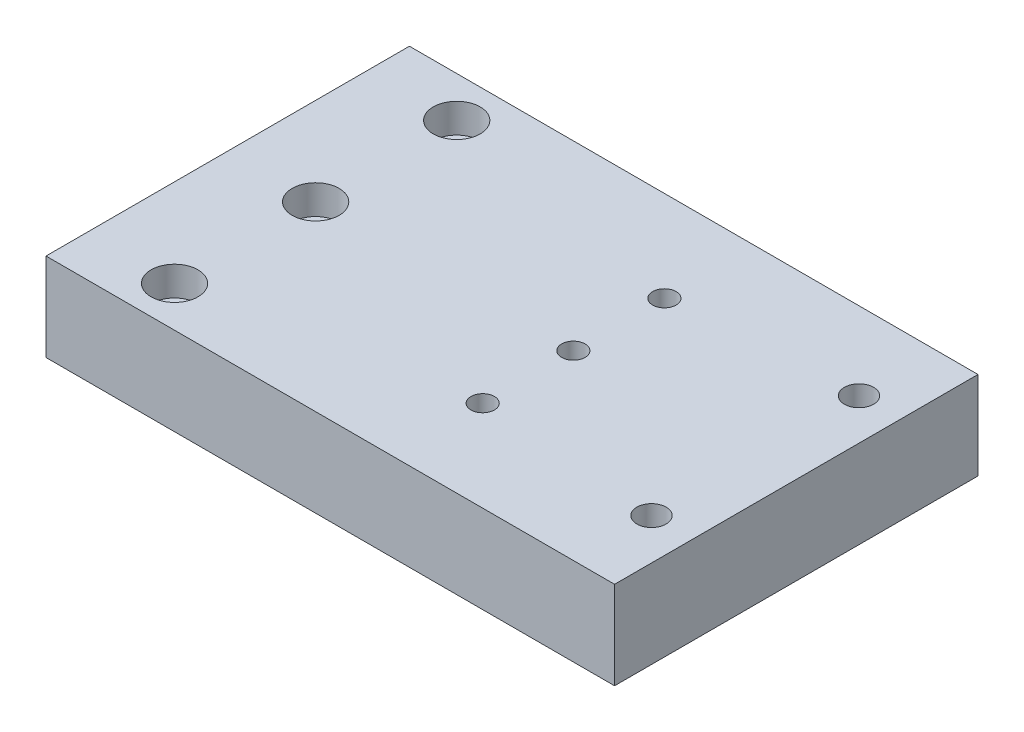
ISO-10303-21;
HEADER;
FILE_DESCRIPTION(('STEP AP214'),'2;1');
FILE_NAME('part.step','',(''),(''),'','','');
FILE_SCHEMA(('AUTOMOTIVE_DESIGN { 1 0 10303 214 1 1 1 1 }'));
ENDSEC;
DATA;
#1=APPLICATION_CONTEXT('core data for automotive mechanical design processes');
#2=APPLICATION_PROTOCOL_DEFINITION('international standard','automotive_design',2000,#1);
#3=PRODUCT_CONTEXT('',#1,'mechanical');
#4=PRODUCT('Part','Part','',(#3));
#5=PRODUCT_RELATED_PRODUCT_CATEGORY('part','',(#4));
#6=PRODUCT_DEFINITION_FORMATION('','',#4);
#7=PRODUCT_DEFINITION_CONTEXT('part definition',#1,'design');
#8=PRODUCT_DEFINITION('design','',#6,#7);
#9=PRODUCT_DEFINITION_SHAPE('','',#8);
#10=(LENGTH_UNIT() NAMED_UNIT(*) SI_UNIT(.MILLI.,.METRE.));
#11=(NAMED_UNIT(*) PLANE_ANGLE_UNIT() SI_UNIT($,.RADIAN.));
#12=(NAMED_UNIT(*) SI_UNIT($,.STERADIAN.) SOLID_ANGLE_UNIT());
#13=UNCERTAINTY_MEASURE_WITH_UNIT(LENGTH_MEASURE(1.E-05),#10,'distance_accuracy_value','');
#14=(GEOMETRIC_REPRESENTATION_CONTEXT(3) GLOBAL_UNCERTAINTY_ASSIGNED_CONTEXT((#13)) GLOBAL_UNIT_ASSIGNED_CONTEXT((#10,
#11,#12)) REPRESENTATION_CONTEXT('',''));
#15=CARTESIAN_POINT('',(0.,0.,0.));
#16=DIRECTION('',(0.,0.,1.));
#17=DIRECTION('',(1.,0.,0.));
#18=AXIS2_PLACEMENT_3D('',#15,#16,#17);
#19=CARTESIAN_POINT('',(-15.,0.,31.));
#20=DIRECTION('',(0.,1.,0.));
#21=DIRECTION('',(0.,0.,1.));
#22=AXIS2_PLACEMENT_3D('',#19,#20,#21);
#23=CYLINDRICAL_SURFACE('',#22,2.5);
#24=CARTESIAN_POINT('',(-15.,0.,31.));
#25=DIRECTION('',(0.,1.,0.));
#26=DIRECTION('',(0.,0.,1.));
#27=AXIS2_PLACEMENT_3D('',#24,#25,#26);
#28=CIRCLE('',#27,2.5);
#29=CARTESIAN_POINT('',(-15.,0.,33.5));
#30=VERTEX_POINT('',#29);
#31=EDGE_CURVE('E102',#30,#30,#28,.T.);
#32=ORIENTED_EDGE('',*,*,#31,.F.);
#33=EDGE_LOOP('',(#32));
#34=FACE_BOUND('',#33,.T.);
#35=CARTESIAN_POINT('',(-15.,10.,31.));
#36=DIRECTION('',(0.,1.,0.));
#37=DIRECTION('',(0.,0.,1.));
#38=AXIS2_PLACEMENT_3D('',#35,#36,#37);
#39=CIRCLE('',#38,2.5);
#40=CARTESIAN_POINT('',(-15.,10.,33.5));
#41=VERTEX_POINT('',#40);
#42=EDGE_CURVE('E39',#41,#41,#39,.F.);
#43=ORIENTED_EDGE('',*,*,#42,.F.);
#44=EDGE_LOOP('',(#43));
#45=FACE_BOUND('',#44,.T.);
#46=ADVANCED_FACE('F35',(#34,#45),#23,.F.);
#47=CARTESIAN_POINT('',(-15.,0.,6.93));
#48=DIRECTION('',(0.,1.,0.));
#49=DIRECTION('',(0.,0.,1.));
#50=AXIS2_PLACEMENT_3D('',#47,#48,#49);
#51=CYLINDRICAL_SURFACE('',#50,2.5);
#52=CARTESIAN_POINT('',(-15.,0.,6.93));
#53=DIRECTION('',(0.,1.,0.));
#54=DIRECTION('',(0.,0.,1.));
#55=AXIS2_PLACEMENT_3D('',#52,#53,#54);
#56=CIRCLE('',#55,2.5);
#57=CARTESIAN_POINT('',(-15.,0.,9.43));
#58=VERTEX_POINT('',#57);
#59=EDGE_CURVE('E105',#58,#58,#56,.T.);
#60=ORIENTED_EDGE('',*,*,#59,.F.);
#61=EDGE_LOOP('',(#60));
#62=FACE_BOUND('',#61,.T.);
#63=CARTESIAN_POINT('',(-15.,10.,6.93));
#64=DIRECTION('',(0.,1.,0.));
#65=DIRECTION('',(0.,0.,1.));
#66=AXIS2_PLACEMENT_3D('',#63,#64,#65);
#67=CIRCLE('',#66,2.5);
#68=CARTESIAN_POINT('',(-15.,10.,9.43));
#69=VERTEX_POINT('',#68);
#70=EDGE_CURVE('E149',#69,#69,#67,.F.);
#71=ORIENTED_EDGE('',*,*,#70,.F.);
#72=EDGE_LOOP('',(#71));
#73=FACE_BOUND('',#72,.T.);
#74=ADVANCED_FACE('F225',(#62,#73),#51,.F.);
#75=CARTESIAN_POINT('',(-15.,0.,55.07));
#76=DIRECTION('',(0.,1.,0.));
#77=DIRECTION('',(0.,0.,1.));
#78=AXIS2_PLACEMENT_3D('',#75,#76,#77);
#79=CYLINDRICAL_SURFACE('',#78,2.5);
#80=CARTESIAN_POINT('',(-15.,0.,55.07));
#81=DIRECTION('',(0.,1.,0.));
#82=DIRECTION('',(0.,0.,1.));
#83=AXIS2_PLACEMENT_3D('',#80,#81,#82);
#84=CIRCLE('',#83,2.5);
#85=CARTESIAN_POINT('',(-15.,0.,57.57));
#86=VERTEX_POINT('',#85);
#87=EDGE_CURVE('E155',#86,#86,#84,.T.);
#88=ORIENTED_EDGE('',*,*,#87,.F.);
#89=EDGE_LOOP('',(#88));
#90=FACE_BOUND('',#89,.T.);
#91=CARTESIAN_POINT('',(-15.,10.,55.07));
#92=DIRECTION('',(0.,1.,0.));
#93=DIRECTION('',(0.,0.,1.));
#94=AXIS2_PLACEMENT_3D('',#91,#92,#93);
#95=CIRCLE('',#94,2.5);
#96=CARTESIAN_POINT('',(-15.,10.,57.57));
#97=VERTEX_POINT('',#96);
#98=EDGE_CURVE('E147',#97,#97,#95,.F.);
#99=ORIENTED_EDGE('',*,*,#98,.F.);
#100=EDGE_LOOP('',(#99));
#101=FACE_BOUND('',#100,.T.);
#102=ADVANCED_FACE('F232',(#90,#101),#79,.F.);
#103=CARTESIAN_POINT('',(0.,15.,62.));
#104=DIRECTION('',(0.,0.,-1.));
#105=DIRECTION('',(-1.,0.,0.));
#106=AXIS2_PLACEMENT_3D('',#103,#104,#105);
#107=PLANE('',#106);
#108=DIRECTION('',(1.,0.,0.));
#109=VECTOR('',#108,1.);
#110=CARTESIAN_POINT('',(0.,0.,62.));
#111=LINE('',#110,#109);
#112=CARTESIAN_POINT('',(-30.,0.,62.));
#113=VERTEX_POINT('',#112);
#114=CARTESIAN_POINT('',(67.,0.,62.));
#115=VERTEX_POINT('',#114);
#116=EDGE_CURVE('E65',#113,#115,#111,.T.);
#117=ORIENTED_EDGE('',*,*,#116,.T.);
#118=DIRECTION('',(0.,-1.,0.));
#119=VECTOR('',#118,1.);
#120=CARTESIAN_POINT('',(67.,15.,62.));
#121=LINE('',#120,#119);
#122=CARTESIAN_POINT('',(67.,15.,62.));
#123=VERTEX_POINT('',#122);
#124=EDGE_CURVE('E11',#123,#115,#121,.T.);
#125=ORIENTED_EDGE('',*,*,#124,.F.);
#126=DIRECTION('',(1.,0.,0.));
#127=VECTOR('',#126,1.);
#128=CARTESIAN_POINT('',(0.,15.,62.));
#129=LINE('',#128,#127);
#130=CARTESIAN_POINT('',(-30.,15.,62.));
#131=VERTEX_POINT('',#130);
#132=EDGE_CURVE('E90',#131,#123,#129,.T.);
#133=ORIENTED_EDGE('',*,*,#132,.F.);
#134=DIRECTION('',(0.,1.,0.));
#135=VECTOR('',#134,1.);
#136=CARTESIAN_POINT('',(-30.,0.,62.));
#137=LINE('',#136,#135);
#138=EDGE_CURVE('E98',#113,#131,#137,.T.);
#139=ORIENTED_EDGE('',*,*,#138,.F.);
#140=EDGE_LOOP('',(#117,#125,#133,#139));
#141=FACE_BOUND('',#140,.T.);
#142=ADVANCED_FACE('F37',(#141),#107,.F.);
#143=CARTESIAN_POINT('',(67.,15.,0.));
#144=DIRECTION('',(-1.,0.,0.));
#145=DIRECTION('',(0.,0.,1.));
#146=AXIS2_PLACEMENT_3D('',#143,#144,#145);
#147=PLANE('',#146);
#148=DIRECTION('',(0.,0.,-1.));
#149=VECTOR('',#148,1.);
#150=CARTESIAN_POINT('',(67.,0.,0.));
#151=LINE('',#150,#149);
#152=CARTESIAN_POINT('',(67.,0.,0.));
#153=VERTEX_POINT('',#152);
#154=EDGE_CURVE('E91',#115,#153,#151,.T.);
#155=ORIENTED_EDGE('',*,*,#154,.T.);
#156=DIRECTION('',(0.,-1.,0.));
#157=VECTOR('',#156,1.);
#158=CARTESIAN_POINT('',(67.,15.,0.));
#159=LINE('',#158,#157);
#160=CARTESIAN_POINT('',(67.,15.,0.));
#161=VERTEX_POINT('',#160);
#162=EDGE_CURVE('E45',#161,#153,#159,.T.);
#163=ORIENTED_EDGE('',*,*,#162,.F.);
#164=DIRECTION('',(0.,0.,-1.));
#165=VECTOR('',#164,1.);
#166=CARTESIAN_POINT('',(67.,15.,0.));
#167=LINE('',#166,#165);
#168=EDGE_CURVE('E54',#123,#161,#167,.T.);
#169=ORIENTED_EDGE('',*,*,#168,.F.);
#170=ORIENTED_EDGE('',*,*,#124,.T.);
#171=EDGE_LOOP('',(#155,#163,#169,#170));
#172=FACE_BOUND('',#171,.T.);
#173=ADVANCED_FACE('F403',(#172),#147,.F.);
#174=CARTESIAN_POINT('',(0.,15.,0.));
#175=DIRECTION('',(0.,0.,1.));
#176=DIRECTION('',(1.,0.,0.));
#177=AXIS2_PLACEMENT_3D('',#174,#175,#176);
#178=PLANE('',#177);
#179=DIRECTION('',(-1.,0.,0.));
#180=VECTOR('',#179,1.);
#181=CARTESIAN_POINT('',(0.,0.,0.));
#182=LINE('',#181,#180);
#183=CARTESIAN_POINT('',(-30.,0.,0.));
#184=VERTEX_POINT('',#183);
#185=EDGE_CURVE('E83',#153,#184,#182,.T.);
#186=ORIENTED_EDGE('',*,*,#185,.T.);
#187=DIRECTION('',(0.,-1.,0.));
#188=VECTOR('',#187,1.);
#189=CARTESIAN_POINT('',(-30.,0.,0.));
#190=LINE('',#189,#188);
#191=CARTESIAN_POINT('',(-30.,15.,0.));
#192=VERTEX_POINT('',#191);
#193=EDGE_CURVE('E87',#192,#184,#190,.T.);
#194=ORIENTED_EDGE('',*,*,#193,.F.);
#195=DIRECTION('',(-1.,0.,0.));
#196=VECTOR('',#195,1.);
#197=CARTESIAN_POINT('',(0.,15.,0.));
#198=LINE('',#197,#196);
#199=EDGE_CURVE('E70',#161,#192,#198,.T.);
#200=ORIENTED_EDGE('',*,*,#199,.F.);
#201=ORIENTED_EDGE('',*,*,#162,.T.);
#202=EDGE_LOOP('',(#186,#194,#200,#201));
#203=FACE_BOUND('',#202,.T.);
#204=ADVANCED_FACE('F85',(#203),#178,.F.);
#205=CARTESIAN_POINT('',(0.,15.,0.));
#206=DIRECTION('',(0.,1.,0.));
#207=DIRECTION('',(0.,0.,1.));
#208=AXIS2_PLACEMENT_3D('',#205,#206,#207);
#209=PLANE('',#208);
#210=CARTESIAN_POINT('',(-15.,15.,6.93));
#211=DIRECTION('',(0.,1.,0.));
#212=DIRECTION('',(0.,0.,1.));
#213=AXIS2_PLACEMENT_3D('',#210,#211,#212);
#214=CIRCLE('',#213,4.);
#215=CARTESIAN_POINT('',(-15.,15.,10.93));
#216=VERTEX_POINT('',#215);
#217=EDGE_CURVE('E176',#216,#216,#214,.T.);
#218=ORIENTED_EDGE('',*,*,#217,.F.);
#219=EDGE_LOOP('',(#218));
#220=FACE_BOUND('',#219,.T.);
#221=CARTESIAN_POINT('',(-15.,15.,31.));
#222=DIRECTION('',(0.,1.,0.));
#223=DIRECTION('',(0.,0.,1.));
#224=AXIS2_PLACEMENT_3D('',#221,#222,#223);
#225=CIRCLE('',#224,4.);
#226=CARTESIAN_POINT('',(-15.,15.,35.));
#227=VERTEX_POINT('',#226);
#228=EDGE_CURVE('E170',#227,#227,#225,.T.);
#229=ORIENTED_EDGE('',*,*,#228,.F.);
#230=EDGE_LOOP('',(#229));
#231=FACE_BOUND('',#230,.T.);
#232=CARTESIAN_POINT('',(-15.,15.,55.07));
#233=DIRECTION('',(0.,1.,0.));
#234=DIRECTION('',(0.,0.,1.));
#235=AXIS2_PLACEMENT_3D('',#232,#233,#234);
#236=CIRCLE('',#235,4.);
#237=CARTESIAN_POINT('',(-15.,15.,59.07));
#238=VERTEX_POINT('',#237);
#239=EDGE_CURVE('E164',#238,#238,#236,.T.);
#240=ORIENTED_EDGE('',*,*,#239,.F.);
#241=EDGE_LOOP('',(#240));
#242=FACE_BOUND('',#241,.T.);
#243=CARTESIAN_POINT('',(29.,15.,15.5));
#244=DIRECTION('',(0.,1.,0.));
#245=DIRECTION('',(0.,0.,1.));
#246=AXIS2_PLACEMENT_3D('',#243,#244,#245);
#247=CIRCLE('',#246,2.);
#248=CARTESIAN_POINT('',(29.,15.,17.5));
#249=VERTEX_POINT('',#248);
#250=EDGE_CURVE('E111',#249,#249,#247,.T.);
#251=ORIENTED_EDGE('',*,*,#250,.F.);
#252=EDGE_LOOP('',(#251));
#253=FACE_BOUND('',#252,.T.);
#254=CARTESIAN_POINT('',(28.9705566332562,15.,31.));
#255=DIRECTION('',(0.,1.,0.));
#256=DIRECTION('',(0.,0.,1.));
#257=AXIS2_PLACEMENT_3D('',#254,#255,#256);
#258=CIRCLE('',#257,2.);
#259=CARTESIAN_POINT('',(28.9705566332562,15.,33.));
#260=VERTEX_POINT('',#259);
#261=EDGE_CURVE('E128',#260,#260,#258,.T.);
#262=ORIENTED_EDGE('',*,*,#261,.F.);
#263=EDGE_LOOP('',(#262));
#264=FACE_BOUND('',#263,.T.);
#265=CARTESIAN_POINT('',(29.,15.,46.5));
#266=DIRECTION('',(0.,1.,0.));
#267=DIRECTION('',(0.,0.,1.));
#268=AXIS2_PLACEMENT_3D('',#265,#266,#267);
#269=CIRCLE('',#268,2.);
#270=CARTESIAN_POINT('',(29.,15.,48.5));
#271=VERTEX_POINT('',#270);
#272=EDGE_CURVE('E122',#271,#271,#269,.T.);
#273=ORIENTED_EDGE('',*,*,#272,.F.);
#274=EDGE_LOOP('',(#273));
#275=FACE_BOUND('',#274,.T.);
#276=CARTESIAN_POINT('',(60.,15.,48.7));
#277=DIRECTION('',(0.,1.,0.));
#278=DIRECTION('',(0.,0.,1.));
#279=AXIS2_PLACEMENT_3D('',#276,#277,#278);
#280=CIRCLE('',#279,2.5);
#281=CARTESIAN_POINT('',(60.,15.,51.2));
#282=VERTEX_POINT('',#281);
#283=EDGE_CURVE('E116',#282,#282,#280,.T.);
#284=ORIENTED_EDGE('',*,*,#283,.F.);
#285=EDGE_LOOP('',(#284));
#286=FACE_BOUND('',#285,.T.);
#287=CARTESIAN_POINT('',(60.,15.,13.3));
#288=DIRECTION('',(0.,1.,0.));
#289=DIRECTION('',(0.,0.,1.));
#290=AXIS2_PLACEMENT_3D('',#287,#288,#289);
#291=CIRCLE('',#290,2.5);
#292=CARTESIAN_POINT('',(60.,15.,15.8));
#293=VERTEX_POINT('',#292);
#294=EDGE_CURVE('E115',#293,#293,#291,.T.);
#295=ORIENTED_EDGE('',*,*,#294,.F.);
#296=EDGE_LOOP('',(#295));
#297=FACE_BOUND('',#296,.T.);
#298=ORIENTED_EDGE('',*,*,#199,.T.);
#299=DIRECTION('',(0.,0.,-1.));
#300=VECTOR('',#299,1.);
#301=CARTESIAN_POINT('',(-30.,15.,0.));
#302=LINE('',#301,#300);
#303=EDGE_CURVE('E101',#131,#192,#302,.T.);
#304=ORIENTED_EDGE('',*,*,#303,.F.);
#305=ORIENTED_EDGE('',*,*,#132,.T.);
#306=ORIENTED_EDGE('',*,*,#168,.T.);
#307=EDGE_LOOP('',(#298,#304,#305,#306));
#308=FACE_BOUND('',#307,.T.);
#309=ADVANCED_FACE('F191',(#220,#231,#242,#253,#264,#275,#286,#297,#308),#209,.T.);
#310=CARTESIAN_POINT('',(0.,0.,0.));
#311=DIRECTION('',(0.,1.,0.));
#312=DIRECTION('',(0.,0.,1.));
#313=AXIS2_PLACEMENT_3D('',#310,#311,#312);
#314=PLANE('',#313);
#315=ORIENTED_EDGE('',*,*,#87,.T.);
#316=EDGE_LOOP('',(#315));
#317=FACE_BOUND('',#316,.T.);
#318=ORIENTED_EDGE('',*,*,#59,.T.);
#319=EDGE_LOOP('',(#318));
#320=FACE_BOUND('',#319,.T.);
#321=ORIENTED_EDGE('',*,*,#31,.T.);
#322=EDGE_LOOP('',(#321));
#323=FACE_BOUND('',#322,.T.);
#324=CARTESIAN_POINT('',(29.,0.,15.5));
#325=DIRECTION('',(0.,1.,0.));
#326=DIRECTION('',(0.,0.,1.));
#327=AXIS2_PLACEMENT_3D('',#324,#325,#326);
#328=CIRCLE('',#327,2.);
#329=CARTESIAN_POINT('',(29.,0.,17.5));
#330=VERTEX_POINT('',#329);
#331=EDGE_CURVE('E131',#330,#330,#328,.T.);
#332=ORIENTED_EDGE('',*,*,#331,.T.);
#333=EDGE_LOOP('',(#332));
#334=FACE_BOUND('',#333,.T.);
#335=CARTESIAN_POINT('',(28.9705566332562,0.,31.));
#336=DIRECTION('',(0.,1.,0.));
#337=DIRECTION('',(0.,0.,1.));
#338=AXIS2_PLACEMENT_3D('',#335,#336,#337);
#339=CIRCLE('',#338,2.);
#340=CARTESIAN_POINT('',(28.9705566332562,0.,33.));
#341=VERTEX_POINT('',#340);
#342=EDGE_CURVE('E125',#341,#341,#339,.T.);
#343=ORIENTED_EDGE('',*,*,#342,.T.);
#344=EDGE_LOOP('',(#343));
#345=FACE_BOUND('',#344,.T.);
#346=CARTESIAN_POINT('',(29.,0.,46.5));
#347=DIRECTION('',(0.,1.,0.));
#348=DIRECTION('',(0.,0.,1.));
#349=AXIS2_PLACEMENT_3D('',#346,#347,#348);
#350=CIRCLE('',#349,2.);
#351=CARTESIAN_POINT('',(29.,0.,48.5));
#352=VERTEX_POINT('',#351);
#353=EDGE_CURVE('E119',#352,#352,#350,.T.);
#354=ORIENTED_EDGE('',*,*,#353,.T.);
#355=EDGE_LOOP('',(#354));
#356=FACE_BOUND('',#355,.T.);
#357=CARTESIAN_POINT('',(60.,0.,48.7));
#358=DIRECTION('',(0.,1.,0.));
#359=DIRECTION('',(0.,0.,1.));
#360=AXIS2_PLACEMENT_3D('',#357,#358,#359);
#361=CIRCLE('',#360,2.5);
#362=CARTESIAN_POINT('',(60.,0.,51.2));
#363=VERTEX_POINT('',#362);
#364=EDGE_CURVE('E112',#363,#363,#361,.T.);
#365=ORIENTED_EDGE('',*,*,#364,.T.);
#366=EDGE_LOOP('',(#365));
#367=FACE_BOUND('',#366,.T.);
#368=CARTESIAN_POINT('',(60.,0.,13.3));
#369=DIRECTION('',(0.,1.,0.));
#370=DIRECTION('',(0.,0.,1.));
#371=AXIS2_PLACEMENT_3D('',#368,#369,#370);
#372=CIRCLE('',#371,2.5);
#373=CARTESIAN_POINT('',(60.,0.,15.8));
#374=VERTEX_POINT('',#373);
#375=EDGE_CURVE('E136',#374,#374,#372,.T.);
#376=ORIENTED_EDGE('',*,*,#375,.T.);
#377=EDGE_LOOP('',(#376));
#378=FACE_BOUND('',#377,.T.);
#379=ORIENTED_EDGE('',*,*,#116,.F.);
#380=DIRECTION('',(0.,0.,1.));
#381=VECTOR('',#380,1.);
#382=CARTESIAN_POINT('',(-30.,0.,0.));
#383=LINE('',#382,#381);
#384=EDGE_CURVE('E94',#184,#113,#383,.T.);
#385=ORIENTED_EDGE('',*,*,#384,.F.);
#386=ORIENTED_EDGE('',*,*,#185,.F.);
#387=ORIENTED_EDGE('',*,*,#154,.F.);
#388=EDGE_LOOP('',(#379,#385,#386,#387));
#389=FACE_BOUND('',#388,.T.);
#390=ADVANCED_FACE('F95',(#317,#320,#323,#334,#345,#356,#367,#378,#389),#314,.F.);
#391=CARTESIAN_POINT('',(60.,0.,13.3));
#392=DIRECTION('',(0.,1.,0.));
#393=DIRECTION('',(0.,0.,1.));
#394=AXIS2_PLACEMENT_3D('',#391,#392,#393);
#395=CYLINDRICAL_SURFACE('',#394,2.5);
#396=ORIENTED_EDGE('',*,*,#375,.F.);
#397=EDGE_LOOP('',(#396));
#398=FACE_BOUND('',#397,.T.);
#399=ORIENTED_EDGE('',*,*,#294,.T.);
#400=EDGE_LOOP('',(#399));
#401=FACE_BOUND('',#400,.T.);
#402=ADVANCED_FACE('F209',(#398,#401),#395,.F.);
#403=CARTESIAN_POINT('',(60.,0.,48.7));
#404=DIRECTION('',(0.,1.,0.));
#405=DIRECTION('',(0.,0.,1.));
#406=AXIS2_PLACEMENT_3D('',#403,#404,#405);
#407=CYLINDRICAL_SURFACE('',#406,2.5);
#408=ORIENTED_EDGE('',*,*,#364,.F.);
#409=EDGE_LOOP('',(#408));
#410=FACE_BOUND('',#409,.T.);
#411=ORIENTED_EDGE('',*,*,#283,.T.);
#412=EDGE_LOOP('',(#411));
#413=FACE_BOUND('',#412,.T.);
#414=ADVANCED_FACE('F211',(#410,#413),#407,.F.);
#415=CARTESIAN_POINT('',(29.,0.,46.5));
#416=DIRECTION('',(0.,1.,0.));
#417=DIRECTION('',(0.,0.,1.));
#418=AXIS2_PLACEMENT_3D('',#415,#416,#417);
#419=CYLINDRICAL_SURFACE('',#418,2.);
#420=ORIENTED_EDGE('',*,*,#353,.F.);
#421=EDGE_LOOP('',(#420));
#422=FACE_BOUND('',#421,.T.);
#423=ORIENTED_EDGE('',*,*,#272,.T.);
#424=EDGE_LOOP('',(#423));
#425=FACE_BOUND('',#424,.T.);
#426=ADVANCED_FACE('F218',(#422,#425),#419,.F.);
#427=CARTESIAN_POINT('',(28.9705566332562,0.,31.));
#428=DIRECTION('',(0.,1.,0.));
#429=DIRECTION('',(0.,0.,1.));
#430=AXIS2_PLACEMENT_3D('',#427,#428,#429);
#431=CYLINDRICAL_SURFACE('',#430,2.);
#432=ORIENTED_EDGE('',*,*,#342,.F.);
#433=EDGE_LOOP('',(#432));
#434=FACE_BOUND('',#433,.T.);
#435=ORIENTED_EDGE('',*,*,#261,.T.);
#436=EDGE_LOOP('',(#435));
#437=FACE_BOUND('',#436,.T.);
#438=ADVANCED_FACE('F245',(#434,#437),#431,.F.);
#439=CARTESIAN_POINT('',(29.,0.,15.5));
#440=DIRECTION('',(0.,1.,0.));
#441=DIRECTION('',(0.,0.,1.));
#442=AXIS2_PLACEMENT_3D('',#439,#440,#441);
#443=CYLINDRICAL_SURFACE('',#442,2.);
#444=ORIENTED_EDGE('',*,*,#331,.F.);
#445=EDGE_LOOP('',(#444));
#446=FACE_BOUND('',#445,.T.);
#447=ORIENTED_EDGE('',*,*,#250,.T.);
#448=EDGE_LOOP('',(#447));
#449=FACE_BOUND('',#448,.T.);
#450=ADVANCED_FACE('F241',(#446,#449),#443,.F.);
#451=CARTESIAN_POINT('',(-30.,0.,0.));
#452=DIRECTION('',(1.,0.,0.));
#453=DIRECTION('',(0.,0.,-1.));
#454=AXIS2_PLACEMENT_3D('',#451,#452,#453);
#455=PLANE('',#454);
#456=ORIENTED_EDGE('',*,*,#193,.T.);
#457=ORIENTED_EDGE('',*,*,#384,.T.);
#458=ORIENTED_EDGE('',*,*,#138,.T.);
#459=ORIENTED_EDGE('',*,*,#303,.T.);
#460=EDGE_LOOP('',(#456,#457,#458,#459));
#461=FACE_BOUND('',#460,.T.);
#462=ADVANCED_FACE('F100',(#461),#455,.F.);
#463=CARTESIAN_POINT('',(-15.,10.,55.07));
#464=DIRECTION('',(0.,1.,0.));
#465=DIRECTION('',(0.,0.,1.));
#466=AXIS2_PLACEMENT_3D('',#463,#464,#465);
#467=PLANE('',#466);
#468=CARTESIAN_POINT('',(-15.,10.,55.07));
#469=DIRECTION('',(0.,1.,0.));
#470=DIRECTION('',(0.,0.,1.));
#471=AXIS2_PLACEMENT_3D('',#468,#469,#470);
#472=CIRCLE('',#471,4.);
#473=CARTESIAN_POINT('',(-15.,10.,59.07));
#474=VERTEX_POINT('',#473);
#475=EDGE_CURVE('E167',#474,#474,#472,.T.);
#476=ORIENTED_EDGE('',*,*,#475,.T.);
#477=EDGE_LOOP('',(#476));
#478=FACE_BOUND('',#477,.T.);
#479=ORIENTED_EDGE('',*,*,#98,.T.);
#480=EDGE_LOOP('',(#479));
#481=FACE_BOUND('',#480,.T.);
#482=ADVANCED_FACE('F240',(#478,#481),#467,.T.);
#483=CARTESIAN_POINT('',(-15.,10.,55.07));
#484=DIRECTION('',(0.,1.,0.));
#485=DIRECTION('',(0.,0.,1.));
#486=AXIS2_PLACEMENT_3D('',#483,#484,#485);
#487=CYLINDRICAL_SURFACE('',#486,4.);
#488=ORIENTED_EDGE('',*,*,#475,.F.);
#489=EDGE_LOOP('',(#488));
#490=FACE_BOUND('',#489,.T.);
#491=ORIENTED_EDGE('',*,*,#239,.T.);
#492=EDGE_LOOP('',(#491));
#493=FACE_BOUND('',#492,.T.);
#494=ADVANCED_FACE('F297',(#490,#493),#487,.F.);
#495=CARTESIAN_POINT('',(-15.,10.,6.93));
#496=DIRECTION('',(0.,1.,0.));
#497=DIRECTION('',(0.,0.,1.));
#498=AXIS2_PLACEMENT_3D('',#495,#496,#497);
#499=PLANE('',#498);
#500=CARTESIAN_POINT('',(-15.,10.,6.93));
#501=DIRECTION('',(0.,1.,0.));
#502=DIRECTION('',(0.,0.,1.));
#503=AXIS2_PLACEMENT_3D('',#500,#501,#502);
#504=CIRCLE('',#503,4.);
#505=CARTESIAN_POINT('',(-15.,10.,10.93));
#506=VERTEX_POINT('',#505);
#507=EDGE_CURVE('E150',#506,#506,#504,.T.);
#508=ORIENTED_EDGE('',*,*,#507,.T.);
#509=EDGE_LOOP('',(#508));
#510=FACE_BOUND('',#509,.T.);
#511=ORIENTED_EDGE('',*,*,#70,.T.);
#512=EDGE_LOOP('',(#511));
#513=FACE_BOUND('',#512,.T.);
#514=ADVANCED_FACE('F182',(#510,#513),#499,.T.);
#515=CARTESIAN_POINT('',(-15.,10.,6.93));
#516=DIRECTION('',(0.,1.,0.));
#517=DIRECTION('',(0.,0.,1.));
#518=AXIS2_PLACEMENT_3D('',#515,#516,#517);
#519=CYLINDRICAL_SURFACE('',#518,4.);
#520=ORIENTED_EDGE('',*,*,#507,.F.);
#521=EDGE_LOOP('',(#520));
#522=FACE_BOUND('',#521,.T.);
#523=ORIENTED_EDGE('',*,*,#217,.T.);
#524=EDGE_LOOP('',(#523));
#525=FACE_BOUND('',#524,.T.);
#526=ADVANCED_FACE('F184',(#522,#525),#519,.F.);
#527=CARTESIAN_POINT('',(-15.,10.,31.));
#528=DIRECTION('',(0.,1.,0.));
#529=DIRECTION('',(0.,0.,1.));
#530=AXIS2_PLACEMENT_3D('',#527,#528,#529);
#531=PLANE('',#530);
#532=CARTESIAN_POINT('',(-15.,10.,31.));
#533=DIRECTION('',(0.,1.,0.));
#534=DIRECTION('',(0.,0.,1.));
#535=AXIS2_PLACEMENT_3D('',#532,#533,#534);
#536=CIRCLE('',#535,4.);
#537=CARTESIAN_POINT('',(-15.,10.,35.));
#538=VERTEX_POINT('',#537);
#539=EDGE_CURVE('E173',#538,#538,#536,.T.);
#540=ORIENTED_EDGE('',*,*,#539,.T.);
#541=EDGE_LOOP('',(#540));
#542=FACE_BOUND('',#541,.T.);
#543=ORIENTED_EDGE('',*,*,#42,.T.);
#544=EDGE_LOOP('',(#543));
#545=FACE_BOUND('',#544,.T.);
#546=ADVANCED_FACE('F187',(#542,#545),#531,.T.);
#547=CARTESIAN_POINT('',(-15.,10.,31.));
#548=DIRECTION('',(0.,1.,0.));
#549=DIRECTION('',(0.,0.,1.));
#550=AXIS2_PLACEMENT_3D('',#547,#548,#549);
#551=CYLINDRICAL_SURFACE('',#550,4.);
#552=ORIENTED_EDGE('',*,*,#539,.F.);
#553=EDGE_LOOP('',(#552));
#554=FACE_BOUND('',#553,.T.);
#555=ORIENTED_EDGE('',*,*,#228,.T.);
#556=EDGE_LOOP('',(#555));
#557=FACE_BOUND('',#556,.T.);
#558=ADVANCED_FACE('F321',(#554,#557),#551,.F.);
#559=CLOSED_SHELL('',(#46,#74,#102,#142,#173,#204,#309,#390,#402,#414,#426,#438,#450,#462,#482,
#494,#514,#526,#546,#558));
#560=MANIFOLD_SOLID_BREP('B2',#559);
#561=ADVANCED_BREP_SHAPE_REPRESENTATION('',(#18,#560),#14);
#562=SHAPE_DEFINITION_REPRESENTATION(#9,#561);
ENDSEC;
END-ISO-10303-21;
